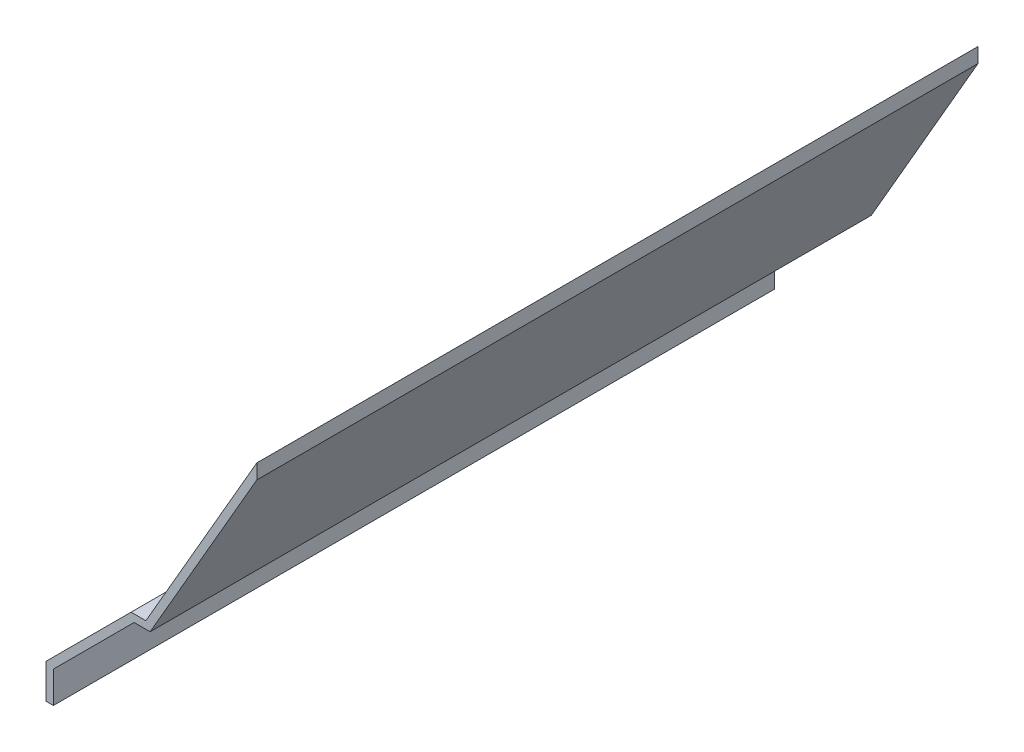
ISO-10303-21;
HEADER;
FILE_DESCRIPTION(('STEP AP214'),'2;1');
FILE_NAME('part.step','',(''),(''),'','','');
FILE_SCHEMA(('AUTOMOTIVE_DESIGN { 1 0 10303 214 1 1 1 1 }'));
ENDSEC;
DATA;
#1=APPLICATION_CONTEXT('core data for automotive mechanical design processes');
#2=APPLICATION_PROTOCOL_DEFINITION('international standard','automotive_design',2000,#1);
#3=PRODUCT_CONTEXT('',#1,'mechanical');
#4=PRODUCT('Part','Part','',(#3));
#5=PRODUCT_RELATED_PRODUCT_CATEGORY('part','',(#4));
#6=PRODUCT_DEFINITION_FORMATION('','',#4);
#7=PRODUCT_DEFINITION_CONTEXT('part definition',#1,'design');
#8=PRODUCT_DEFINITION('design','',#6,#7);
#9=PRODUCT_DEFINITION_SHAPE('','',#8);
#10=(LENGTH_UNIT() NAMED_UNIT(*) SI_UNIT(.MILLI.,.METRE.));
#11=(NAMED_UNIT(*) PLANE_ANGLE_UNIT() SI_UNIT($,.RADIAN.));
#12=(NAMED_UNIT(*) SI_UNIT($,.STERADIAN.) SOLID_ANGLE_UNIT());
#13=UNCERTAINTY_MEASURE_WITH_UNIT(LENGTH_MEASURE(1.E-05),#10,'distance_accuracy_value','');
#14=(GEOMETRIC_REPRESENTATION_CONTEXT(3) GLOBAL_UNCERTAINTY_ASSIGNED_CONTEXT((#13)) GLOBAL_UNIT_ASSIGNED_CONTEXT((#10,
#11,#12)) REPRESENTATION_CONTEXT('',''));
#15=CARTESIAN_POINT('',(0.,0.,0.));
#16=DIRECTION('',(0.,0.,1.));
#17=DIRECTION('',(1.,0.,0.));
#18=AXIS2_PLACEMENT_3D('',#15,#16,#17);
#19=CARTESIAN_POINT('',(-106.888143665837,84.1038517563225,195.));
#20=DIRECTION('',(0.,1.,0.));
#21=DIRECTION('',(0.,0.,1.));
#22=AXIS2_PLACEMENT_3D('',#19,#20,#21);
#23=PLANE('',#22);
#24=DIRECTION('',(1.,0.,0.));
#25=VECTOR('',#24,1.);
#26=CARTESIAN_POINT('',(-106.888143665837,84.1038517563225,0.));
#27=LINE('',#26,#25);
#28=CARTESIAN_POINT('',(-106.888143665837,84.1038517563225,0.));
#29=VERTEX_POINT('',#28);
#30=CARTESIAN_POINT('',(-104.888143665837,84.1038517563225,0.));
#31=VERTEX_POINT('',#30);
#32=EDGE_CURVE('E151',#29,#31,#27,.T.);
#33=ORIENTED_EDGE('',*,*,#32,.T.);
#34=DIRECTION('',(0.,0.,-1.));
#35=VECTOR('',#34,1.);
#36=CARTESIAN_POINT('',(-104.888143665837,84.1038517563225,195.));
#37=LINE('',#36,#35);
#38=CARTESIAN_POINT('',(-104.888143665837,84.1038517563225,195.));
#39=VERTEX_POINT('',#38);
#40=EDGE_CURVE('E11',#39,#31,#37,.T.);
#41=ORIENTED_EDGE('',*,*,#40,.F.);
#42=DIRECTION('',(1.,0.,0.));
#43=VECTOR('',#42,1.);
#44=CARTESIAN_POINT('',(-106.888143665837,84.1038517563225,195.));
#45=LINE('',#44,#43);
#46=CARTESIAN_POINT('',(-106.888143665837,84.1038517563225,195.));
#47=VERTEX_POINT('',#46);
#48=EDGE_CURVE('E169',#47,#39,#45,.T.);
#49=ORIENTED_EDGE('',*,*,#48,.F.);
#50=DIRECTION('',(0.,0.,-1.));
#51=VECTOR('',#50,1.);
#52=CARTESIAN_POINT('',(-106.888143665837,84.1038517563225,195.));
#53=LINE('',#52,#51);
#54=EDGE_CURVE('E147',#47,#29,#53,.T.);
#55=ORIENTED_EDGE('',*,*,#54,.T.);
#56=EDGE_LOOP('',(#33,#41,#49,#55));
#57=FACE_BOUND('',#56,.T.);
#58=ADVANCED_FACE('F43',(#57),#23,.F.);
#59=CARTESIAN_POINT('',(-104.888143665837,84.1038517563225,195.));
#60=DIRECTION('',(-1.,0.,0.));
#61=DIRECTION('',(0.,0.,1.));
#62=AXIS2_PLACEMENT_3D('',#59,#60,#61);
#63=PLANE('',#62);
#64=DIRECTION('',(0.,1.,0.));
#65=VECTOR('',#64,1.);
#66=CARTESIAN_POINT('',(-104.888143665837,84.1038517563225,0.));
#67=LINE('',#66,#65);
#68=CARTESIAN_POINT('',(-104.888143665837,92.6307636909038,0.));
#69=VERTEX_POINT('',#68);
#70=EDGE_CURVE('E154',#31,#69,#67,.T.);
#71=ORIENTED_EDGE('',*,*,#70,.T.);
#72=DIRECTION('',(0.,0.,-1.));
#73=VECTOR('',#72,1.);
#74=CARTESIAN_POINT('',(-104.888143665837,92.6307636909038,195.));
#75=LINE('',#74,#73);
#76=CARTESIAN_POINT('',(-104.888143665837,92.6307636909038,195.));
#77=VERTEX_POINT('',#76);
#78=EDGE_CURVE('E51',#77,#69,#75,.T.);
#79=ORIENTED_EDGE('',*,*,#78,.F.);
#80=DIRECTION('',(0.,1.,0.));
#81=VECTOR('',#80,1.);
#82=CARTESIAN_POINT('',(-104.888143665837,84.1038517563225,195.));
#83=LINE('',#82,#81);
#84=EDGE_CURVE('E108',#39,#77,#83,.T.);
#85=ORIENTED_EDGE('',*,*,#84,.F.);
#86=ORIENTED_EDGE('',*,*,#40,.T.);
#87=EDGE_LOOP('',(#71,#79,#85,#86));
#88=FACE_BOUND('',#87,.T.);
#89=ADVANCED_FACE('F218',(#88),#63,.F.);
#90=CARTESIAN_POINT('',(-104.888143665837,92.6307636909038,195.));
#91=DIRECTION('',(-0.707106781186547,0.707106781186547,0.));
#92=DIRECTION('',(-0.707106781186548,-0.707106781186548,0.));
#93=AXIS2_PLACEMENT_3D('',#90,#91,#92);
#94=PLANE('',#93);
#95=DIRECTION('',(0.707106781186547,0.707106781186547,0.));
#96=VECTOR('',#95,1.);
#97=CARTESIAN_POINT('',(-104.888143665837,92.6307636909038,0.));
#98=LINE('',#97,#96);
#99=CARTESIAN_POINT('',(-83.0597165410906,114.45919081565,0.));
#100=VERTEX_POINT('',#99);
#101=EDGE_CURVE('E156',#69,#100,#98,.T.);
#102=ORIENTED_EDGE('',*,*,#101,.T.);
#103=DIRECTION('',(0.,0.,-1.));
#104=VECTOR('',#103,1.);
#105=CARTESIAN_POINT('',(-83.0597165410906,114.45919081565,195.));
#106=LINE('',#105,#104);
#107=CARTESIAN_POINT('',(-83.0597165410906,114.45919081565,195.));
#108=VERTEX_POINT('',#107);
#109=EDGE_CURVE('E182',#108,#100,#106,.T.);
#110=ORIENTED_EDGE('',*,*,#109,.F.);
#111=DIRECTION('',(0.707106781186547,0.707106781186547,0.));
#112=VECTOR('',#111,1.);
#113=CARTESIAN_POINT('',(-104.888143665837,92.6307636909038,195.));
#114=LINE('',#113,#112);
#115=EDGE_CURVE('E190',#77,#108,#114,.T.);
#116=ORIENTED_EDGE('',*,*,#115,.F.);
#117=ORIENTED_EDGE('',*,*,#78,.T.);
#118=EDGE_LOOP('',(#102,#110,#116,#117));
#119=FACE_BOUND('',#118,.T.);
#120=ADVANCED_FACE('F188',(#119),#94,.F.);
#121=CARTESIAN_POINT('',(-83.0597165410906,114.45919081565,195.));
#122=DIRECTION('',(0.,1.,0.));
#123=DIRECTION('',(0.,0.,1.));
#124=AXIS2_PLACEMENT_3D('',#121,#122,#123);
#125=PLANE('',#124);
#126=DIRECTION('',(1.,0.,0.));
#127=VECTOR('',#126,1.);
#128=CARTESIAN_POINT('',(-83.0597165410906,114.45919081565,0.));
#129=LINE('',#128,#127);
#130=CARTESIAN_POINT('',(-78.7334431274572,114.45919081565,0.));
#131=VERTEX_POINT('',#130);
#132=EDGE_CURVE('E158',#100,#131,#129,.T.);
#133=ORIENTED_EDGE('',*,*,#132,.T.);
#134=DIRECTION('',(0.,0.,-1.));
#135=VECTOR('',#134,1.);
#136=CARTESIAN_POINT('',(-78.7334431274572,114.45919081565,195.));
#137=LINE('',#136,#135);
#138=CARTESIAN_POINT('',(-78.7334431274572,114.45919081565,195.));
#139=VERTEX_POINT('',#138);
#140=EDGE_CURVE('E179',#139,#131,#137,.T.);
#141=ORIENTED_EDGE('',*,*,#140,.F.);
#142=DIRECTION('',(1.,0.,0.));
#143=VECTOR('',#142,1.);
#144=CARTESIAN_POINT('',(-83.0597165410906,114.45919081565,195.));
#145=LINE('',#144,#143);
#146=EDGE_CURVE('E208',#108,#139,#145,.T.);
#147=ORIENTED_EDGE('',*,*,#146,.F.);
#148=ORIENTED_EDGE('',*,*,#109,.T.);
#149=EDGE_LOOP('',(#133,#141,#147,#148));
#150=FACE_BOUND('',#149,.T.);
#151=ADVANCED_FACE('F199',(#150),#125,.F.);
#152=CARTESIAN_POINT('',(-78.7334431274572,114.45919081565,195.));
#153=DIRECTION('',(-0.866025403784441,0.499999999999995,0.));
#154=DIRECTION('',(-0.499999999999995,-0.866025403784442,0.));
#155=AXIS2_PLACEMENT_3D('',#152,#153,#154);
#156=PLANE('',#155);
#157=DIRECTION('',(0.499999999999995,0.866025403784442,0.));
#158=VECTOR('',#157,1.);
#159=CARTESIAN_POINT('',(-78.7334431274572,114.45919081565,0.));
#160=LINE('',#159,#158);
#161=CARTESIAN_POINT('',(-49.8881436658368,164.420715042716,0.));
#162=VERTEX_POINT('',#161);
#163=EDGE_CURVE('E160',#131,#162,#160,.T.);
#164=ORIENTED_EDGE('',*,*,#163,.T.);
#165=DIRECTION('',(0.,0.,-1.));
#166=VECTOR('',#165,1.);
#167=CARTESIAN_POINT('',(-49.8881436658368,164.420715042716,195.));
#168=LINE('',#167,#166);
#169=CARTESIAN_POINT('',(-49.8881436658368,164.420715042716,195.));
#170=VERTEX_POINT('',#169);
#171=EDGE_CURVE('E176',#170,#162,#168,.T.);
#172=ORIENTED_EDGE('',*,*,#171,.F.);
#173=DIRECTION('',(0.499999999999995,0.866025403784442,0.));
#174=VECTOR('',#173,1.);
#175=CARTESIAN_POINT('',(-78.7334431274572,114.45919081565,195.));
#176=LINE('',#175,#174);
#177=EDGE_CURVE('E205',#139,#170,#176,.T.);
#178=ORIENTED_EDGE('',*,*,#177,.F.);
#179=ORIENTED_EDGE('',*,*,#140,.T.);
#180=EDGE_LOOP('',(#164,#172,#178,#179));
#181=FACE_BOUND('',#180,.T.);
#182=ADVANCED_FACE('F203',(#181),#156,.F.);
#183=CARTESIAN_POINT('',(-49.8881436658368,168.420715042716,195.));
#184=DIRECTION('',(-1.,0.,0.));
#185=DIRECTION('',(0.,-1.,0.));
#186=AXIS2_PLACEMENT_3D('',#183,#184,#185);
#187=PLANE('',#186);
#188=DIRECTION('',(0.,1.,0.));
#189=VECTOR('',#188,1.);
#190=CARTESIAN_POINT('',(-49.8881436658368,168.420715042716,0.));
#191=LINE('',#190,#189);
#192=CARTESIAN_POINT('',(-49.8881436658368,168.420715042716,0.));
#193=VERTEX_POINT('',#192);
#194=EDGE_CURVE('E162',#162,#193,#191,.T.);
#195=ORIENTED_EDGE('',*,*,#194,.T.);
#196=DIRECTION('',(0.,0.,-1.));
#197=VECTOR('',#196,1.);
#198=CARTESIAN_POINT('',(-49.8881436658368,168.420715042716,195.));
#199=LINE('',#198,#197);
#200=CARTESIAN_POINT('',(-49.8881436658368,168.420715042716,195.));
#201=VERTEX_POINT('',#200);
#202=EDGE_CURVE('E173',#201,#193,#199,.T.);
#203=ORIENTED_EDGE('',*,*,#202,.F.);
#204=DIRECTION('',(0.,1.,0.));
#205=VECTOR('',#204,1.);
#206=CARTESIAN_POINT('',(-49.8881436658368,168.420715042716,195.));
#207=LINE('',#206,#205);
#208=EDGE_CURVE('E207',#170,#201,#207,.T.);
#209=ORIENTED_EDGE('',*,*,#208,.F.);
#210=ORIENTED_EDGE('',*,*,#171,.T.);
#211=EDGE_LOOP('',(#195,#203,#209,#210));
#212=FACE_BOUND('',#211,.T.);
#213=ADVANCED_FACE('F230',(#212),#187,.F.);
#214=CARTESIAN_POINT('',(-79.8881436658364,116.45919081565,195.));
#215=DIRECTION('',(0.866025403784442,-0.499999999999995,0.));
#216=DIRECTION('',(0.499999999999995,0.866025403784442,0.));
#217=AXIS2_PLACEMENT_3D('',#214,#215,#216);
#218=PLANE('',#217);
#219=DIRECTION('',(-0.499999999999995,-0.866025403784441,0.));
#220=VECTOR('',#219,1.);
#221=CARTESIAN_POINT('',(-79.8881436658364,116.45919081565,0.));
#222=LINE('',#221,#220);
#223=CARTESIAN_POINT('',(-79.8881436658364,116.45919081565,0.));
#224=VERTEX_POINT('',#223);
#225=EDGE_CURVE('E164',#193,#224,#222,.T.);
#226=ORIENTED_EDGE('',*,*,#225,.T.);
#227=DIRECTION('',(0.,0.,-1.));
#228=VECTOR('',#227,1.);
#229=CARTESIAN_POINT('',(-79.8881436658364,116.45919081565,195.));
#230=LINE('',#229,#228);
#231=CARTESIAN_POINT('',(-79.8881436658364,116.45919081565,195.));
#232=VERTEX_POINT('',#231);
#233=EDGE_CURVE('E142',#232,#224,#230,.T.);
#234=ORIENTED_EDGE('',*,*,#233,.F.);
#235=DIRECTION('',(-0.499999999999995,-0.866025403784441,0.));
#236=VECTOR('',#235,1.);
#237=CARTESIAN_POINT('',(-79.8881436658364,116.45919081565,195.));
#238=LINE('',#237,#236);
#239=EDGE_CURVE('E133',#201,#232,#238,.T.);
#240=ORIENTED_EDGE('',*,*,#239,.F.);
#241=ORIENTED_EDGE('',*,*,#202,.T.);
#242=EDGE_LOOP('',(#226,#234,#240,#241));
#243=FACE_BOUND('',#242,.T.);
#244=ADVANCED_FACE('F233',(#243),#218,.F.);
#245=CARTESIAN_POINT('',(-83.8881436658367,116.45919081565,195.));
#246=DIRECTION('',(0.,-1.,0.));
#247=DIRECTION('',(1.,0.,0.));
#248=AXIS2_PLACEMENT_3D('',#245,#246,#247);
#249=PLANE('',#248);
#250=DIRECTION('',(-1.,0.,0.));
#251=VECTOR('',#250,1.);
#252=CARTESIAN_POINT('',(-83.8881436658367,116.45919081565,0.));
#253=LINE('',#252,#251);
#254=CARTESIAN_POINT('',(-83.8881436658367,116.45919081565,0.));
#255=VERTEX_POINT('',#254);
#256=EDGE_CURVE('E141',#224,#255,#253,.T.);
#257=ORIENTED_EDGE('',*,*,#256,.T.);
#258=DIRECTION('',(0.,0.,-1.));
#259=VECTOR('',#258,1.);
#260=CARTESIAN_POINT('',(-83.8881436658367,116.45919081565,195.));
#261=LINE('',#260,#259);
#262=CARTESIAN_POINT('',(-83.8881436658367,116.45919081565,195.));
#263=VERTEX_POINT('',#262);
#264=EDGE_CURVE('E138',#263,#255,#261,.T.);
#265=ORIENTED_EDGE('',*,*,#264,.F.);
#266=DIRECTION('',(-1.,0.,0.));
#267=VECTOR('',#266,1.);
#268=CARTESIAN_POINT('',(-83.8881436658367,116.45919081565,195.));
#269=LINE('',#268,#267);
#270=EDGE_CURVE('E127',#232,#263,#269,.T.);
#271=ORIENTED_EDGE('',*,*,#270,.F.);
#272=ORIENTED_EDGE('',*,*,#233,.T.);
#273=EDGE_LOOP('',(#257,#265,#271,#272));
#274=FACE_BOUND('',#273,.T.);
#275=ADVANCED_FACE('F139',(#274),#249,.F.);
#276=CARTESIAN_POINT('',(-106.888143665837,93.45919081565,195.));
#277=DIRECTION('',(0.707106781186547,-0.707106781186548,0.));
#278=DIRECTION('',(0.707106781186548,0.707106781186547,0.));
#279=AXIS2_PLACEMENT_3D('',#276,#277,#278);
#280=PLANE('',#279);
#281=DIRECTION('',(-0.707106781186548,-0.707106781186547,0.));
#282=VECTOR('',#281,1.);
#283=CARTESIAN_POINT('',(-106.888143665837,93.45919081565,0.));
#284=LINE('',#283,#282);
#285=CARTESIAN_POINT('',(-106.888143665837,93.45919081565,0.));
#286=VERTEX_POINT('',#285);
#287=EDGE_CURVE('E94',#255,#286,#284,.T.);
#288=ORIENTED_EDGE('',*,*,#287,.T.);
#289=DIRECTION('',(0.,0.,-1.));
#290=VECTOR('',#289,1.);
#291=CARTESIAN_POINT('',(-106.888143665837,93.45919081565,195.));
#292=LINE('',#291,#290);
#293=CARTESIAN_POINT('',(-106.888143665837,93.45919081565,195.));
#294=VERTEX_POINT('',#293);
#295=EDGE_CURVE('E143',#294,#286,#292,.T.);
#296=ORIENTED_EDGE('',*,*,#295,.F.);
#297=DIRECTION('',(-0.707106781186548,-0.707106781186547,0.));
#298=VECTOR('',#297,1.);
#299=CARTESIAN_POINT('',(-106.888143665837,93.45919081565,195.));
#300=LINE('',#299,#298);
#301=EDGE_CURVE('E131',#263,#294,#300,.T.);
#302=ORIENTED_EDGE('',*,*,#301,.F.);
#303=ORIENTED_EDGE('',*,*,#264,.T.);
#304=EDGE_LOOP('',(#288,#296,#302,#303));
#305=FACE_BOUND('',#304,.T.);
#306=ADVANCED_FACE('F145',(#305),#280,.F.);
#307=CARTESIAN_POINT('',(-106.888143665837,84.1038517563225,195.));
#308=DIRECTION('',(1.,0.,0.));
#309=DIRECTION('',(0.,1.,0.));
#310=AXIS2_PLACEMENT_3D('',#307,#308,#309);
#311=PLANE('',#310);
#312=DIRECTION('',(0.,-1.,0.));
#313=VECTOR('',#312,1.);
#314=CARTESIAN_POINT('',(-106.888143665837,84.1038517563225,0.));
#315=LINE('',#314,#313);
#316=EDGE_CURVE('E100',#286,#29,#315,.T.);
#317=ORIENTED_EDGE('',*,*,#316,.T.);
#318=ORIENTED_EDGE('',*,*,#54,.F.);
#319=DIRECTION('',(0.,-1.,0.));
#320=VECTOR('',#319,1.);
#321=CARTESIAN_POINT('',(-106.888143665837,84.1038517563225,195.));
#322=LINE('',#321,#320);
#323=EDGE_CURVE('E59',#294,#47,#322,.T.);
#324=ORIENTED_EDGE('',*,*,#323,.F.);
#325=ORIENTED_EDGE('',*,*,#295,.T.);
#326=EDGE_LOOP('',(#317,#318,#324,#325));
#327=FACE_BOUND('',#326,.T.);
#328=ADVANCED_FACE('F242',(#327),#311,.F.);
#329=CARTESIAN_POINT('',(0.,0.,195.));
#330=DIRECTION('',(0.,0.,1.));
#331=DIRECTION('',(1.,0.,0.));
#332=AXIS2_PLACEMENT_3D('',#329,#330,#331);
#333=PLANE('',#332);
#334=ORIENTED_EDGE('',*,*,#48,.T.);
#335=ORIENTED_EDGE('',*,*,#84,.T.);
#336=ORIENTED_EDGE('',*,*,#115,.T.);
#337=ORIENTED_EDGE('',*,*,#146,.T.);
#338=ORIENTED_EDGE('',*,*,#177,.T.);
#339=ORIENTED_EDGE('',*,*,#208,.T.);
#340=ORIENTED_EDGE('',*,*,#239,.T.);
#341=ORIENTED_EDGE('',*,*,#270,.T.);
#342=ORIENTED_EDGE('',*,*,#301,.T.);
#343=ORIENTED_EDGE('',*,*,#323,.T.);
#344=EDGE_LOOP('',(#334,#335,#336,#337,#338,#339,#340,#341,#342,#343));
#345=FACE_BOUND('',#344,.T.);
#346=ADVANCED_FACE('F129',(#345),#333,.T.);
#347=CARTESIAN_POINT('',(0.,0.,0.));
#348=DIRECTION('',(0.,0.,1.));
#349=DIRECTION('',(1.,0.,0.));
#350=AXIS2_PLACEMENT_3D('',#347,#348,#349);
#351=PLANE('',#350);
#352=ORIENTED_EDGE('',*,*,#32,.F.);
#353=ORIENTED_EDGE('',*,*,#316,.F.);
#354=ORIENTED_EDGE('',*,*,#287,.F.);
#355=ORIENTED_EDGE('',*,*,#256,.F.);
#356=ORIENTED_EDGE('',*,*,#225,.F.);
#357=ORIENTED_EDGE('',*,*,#194,.F.);
#358=ORIENTED_EDGE('',*,*,#163,.F.);
#359=ORIENTED_EDGE('',*,*,#132,.F.);
#360=ORIENTED_EDGE('',*,*,#101,.F.);
#361=ORIENTED_EDGE('',*,*,#70,.F.);
#362=EDGE_LOOP('',(#352,#353,#354,#355,#356,#357,#358,#359,#360,#361));
#363=FACE_BOUND('',#362,.T.);
#364=ADVANCED_FACE('F194',(#363),#351,.F.);
#365=CLOSED_SHELL('',(#58,#89,#120,#151,#182,#213,#244,#275,#306,#328,#346,#364));
#366=MANIFOLD_SOLID_BREP('B2',#365);
#367=ADVANCED_BREP_SHAPE_REPRESENTATION('',(#18,#366),#14);
#368=SHAPE_DEFINITION_REPRESENTATION(#9,#367);
ENDSEC;
END-ISO-10303-21;
